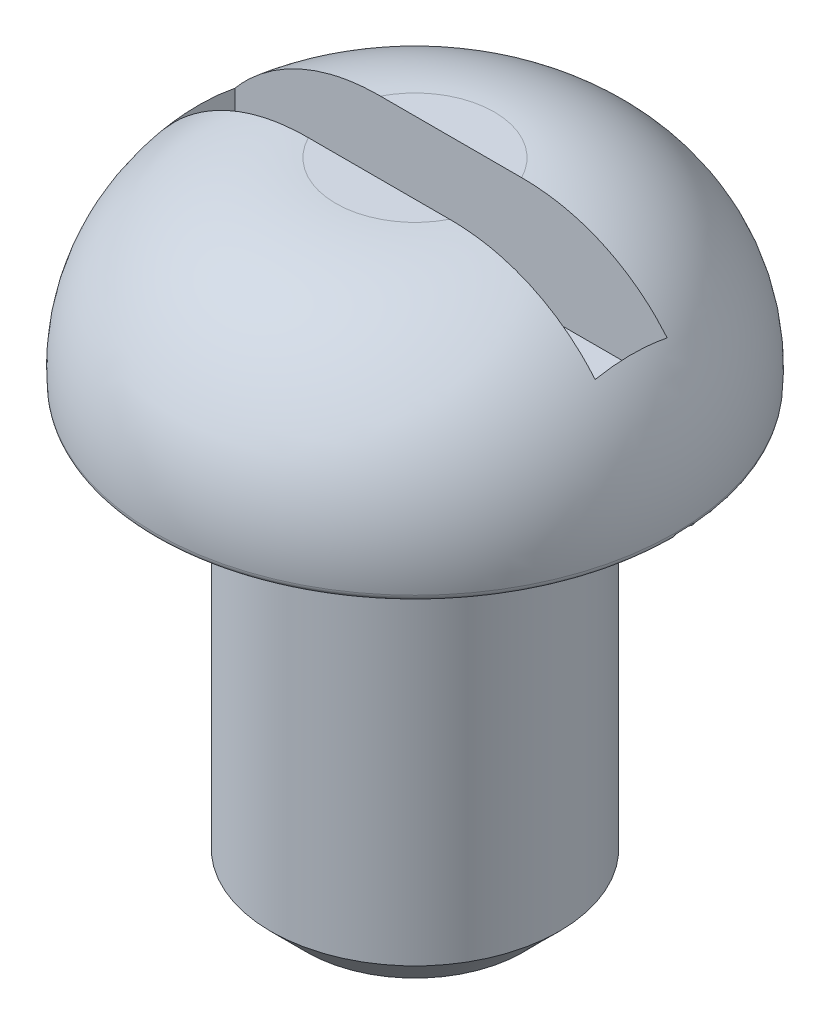
ISO-10303-21;
HEADER;
FILE_DESCRIPTION(('STEP AP214'),'2;1');
FILE_NAME('part.step','',(''),(''),'','','');
FILE_SCHEMA(('AUTOMOTIVE_DESIGN { 1 0 10303 214 1 1 1 1 }'));
ENDSEC;
DATA;
#1=APPLICATION_CONTEXT('core data for automotive mechanical design processes');
#2=APPLICATION_PROTOCOL_DEFINITION('international standard','automotive_design',2000,#1);
#3=PRODUCT_CONTEXT('',#1,'mechanical');
#4=PRODUCT('Part','Part','',(#3));
#5=PRODUCT_RELATED_PRODUCT_CATEGORY('part','',(#4));
#6=PRODUCT_DEFINITION_FORMATION('','',#4);
#7=PRODUCT_DEFINITION_CONTEXT('part definition',#1,'design');
#8=PRODUCT_DEFINITION('design','',#6,#7);
#9=PRODUCT_DEFINITION_SHAPE('','',#8);
#10=(LENGTH_UNIT() NAMED_UNIT(*) SI_UNIT(.MILLI.,.METRE.));
#11=(NAMED_UNIT(*) PLANE_ANGLE_UNIT() SI_UNIT($,.RADIAN.));
#12=(NAMED_UNIT(*) SI_UNIT($,.STERADIAN.) SOLID_ANGLE_UNIT());
#13=UNCERTAINTY_MEASURE_WITH_UNIT(LENGTH_MEASURE(1.E-05),#10,'distance_accuracy_value','');
#14=(GEOMETRIC_REPRESENTATION_CONTEXT(3) GLOBAL_UNCERTAINTY_ASSIGNED_CONTEXT((#13)) GLOBAL_UNIT_ASSIGNED_CONTEXT((#10,
#11,#12)) REPRESENTATION_CONTEXT('',''));
#15=CARTESIAN_POINT('',(0.,0.,0.));
#16=DIRECTION('',(0.,0.,1.));
#17=DIRECTION('',(1.,0.,0.));
#18=AXIS2_PLACEMENT_3D('',#15,#16,#17);
#19=CARTESIAN_POINT('',(0.,8.8,0.));
#20=DIRECTION('',(0.,1.,0.));
#21=DIRECTION('',(0.,0.,1.));
#22=AXIS2_PLACEMENT_3D('',#19,#20,#21);
#23=PLANE('',#22);
#24=DIRECTION('',(-1.,0.,0.));
#25=VECTOR('',#24,1.);
#26=CARTESIAN_POINT('',(-3.,8.8,-0.499999999999999));
#27=LINE('',#26,#25);
#28=CARTESIAN_POINT('',(0.979795897113272,8.8,-0.5));
#29=VERTEX_POINT('',#28);
#30=CARTESIAN_POINT('',(-0.979795897113272,8.8,-0.5));
#31=VERTEX_POINT('',#30);
#32=EDGE_CURVE('E105',#29,#31,#27,.T.);
#33=ORIENTED_EDGE('',*,*,#32,.F.);
#34=CARTESIAN_POINT('',(0.,8.8,0.));
#35=DIRECTION('',(0.,-1.,0.));
#36=DIRECTION('',(0.,0.,-1.));
#37=AXIS2_PLACEMENT_3D('',#34,#35,#36);
#38=CIRCLE('',#37,1.1);
#39=EDGE_CURVE('E128',#31,#29,#38,.T.);
#40=ORIENTED_EDGE('',*,*,#39,.F.);
#41=EDGE_LOOP('',(#33,#40));
#42=FACE_BOUND('',#41,.T.);
#43=ADVANCED_FACE('F29',(#42),#23,.T.);
#44=CARTESIAN_POINT('',(1.5,0.,0.));
#45=DIRECTION('',(0.,-1.,0.));
#46=DIRECTION('',(0.,0.,-1.));
#47=AXIS2_PLACEMENT_3D('',#44,#45,#46);
#48=PLANE('',#47);
#49=CARTESIAN_POINT('',(0.,0.,0.));
#50=DIRECTION('',(0.,-1.,0.));
#51=DIRECTION('',(0.,0.,-1.));
#52=AXIS2_PLACEMENT_3D('',#49,#50,#51);
#53=CIRCLE('',#52,1.5);
#54=CARTESIAN_POINT('',(0.,0.,-1.5));
#55=VERTEX_POINT('',#54);
#56=EDGE_CURVE('E115',#55,#55,#53,.T.);
#57=ORIENTED_EDGE('',*,*,#56,.T.);
#58=EDGE_LOOP('',(#57));
#59=FACE_BOUND('',#58,.T.);
#60=ADVANCED_FACE('F31',(#59),#48,.T.);
#61=DIRECTION('',(1.,0.,0.));
#62=VECTOR('',#61,1.);
#63=CARTESIAN_POINT('',(-3.,8.8,0.5));
#64=LINE('',#63,#62);
#65=CARTESIAN_POINT('',(-0.979795897113272,8.8,0.5));
#66=VERTEX_POINT('',#65);
#67=CARTESIAN_POINT('',(0.979795897113272,8.8,0.5));
#68=VERTEX_POINT('',#67);
#69=EDGE_CURVE('E107',#66,#68,#64,.T.);
#70=ORIENTED_EDGE('',*,*,#69,.F.);
#71=EDGE_CURVE('E131',#68,#66,#38,.T.);
#72=ORIENTED_EDGE('',*,*,#71,.F.);
#73=EDGE_LOOP('',(#70,#72));
#74=FACE_BOUND('',#73,.T.);
#75=ADVANCED_FACE('F176',(#74),#23,.T.);
#76=CARTESIAN_POINT('',(0.,6.28392857142857,0.));
#77=DIRECTION('',(0.,-1.,0.));
#78=DIRECTION('',(0.,0.,-1.));
#79=AXIS2_PLACEMENT_3D('',#76,#77,#78);
#80=DEGENERATE_TOROIDAL_SURFACE('',#79,1.1,2.51607142857143,.T.);
#81=CARTESIAN_POINT('',(0.,8.72741285287453,-0.5));
#82=CARTESIAN_POINT('',(-0.0422818392167979,8.72741654693849,-0.5));
#83=CARTESIAN_POINT('',(-0.0845648077539233,8.72877327592071,-0.5));
#84=CARTESIAN_POINT('',(-0.16903295112575,8.73371678296004,-0.5));
#85=CARTESIAN_POINT('',(-0.211217957322735,8.73730612669833,-0.5));
#86=CARTESIAN_POINT('',(-0.295732319609197,8.74568730123717,-0.5));
#87=CARTESIAN_POINT('',(-0.338060855781322,8.75048672709458,-0.5));
#88=CARTESIAN_POINT('',(-0.42268796162483,8.76026727094819,-0.5));
#89=CARTESIAN_POINT('',(-0.464986535283326,8.7652483565223,-0.5));
#90=CARTESIAN_POINT('',(-0.549995859987487,8.77469082090246,-0.5));
#91=CARTESIAN_POINT('',(-0.592707150305704,8.77914761083377,-0.5));
#92=CARTESIAN_POINT('',(-0.678226998569677,8.78698758227835,-0.5));
#93=CARTESIAN_POINT('',(-0.721035552525858,8.79037080705423,-0.5));
#94=CARTESIAN_POINT('',(-0.84958950567168,8.79837652375647,-0.5));
#95=CARTESIAN_POINT('',(-0.935489790921104,8.80085850297676,-0.5));
#96=CARTESIAN_POINT('',(-1.1067831178282,8.7985979859046,-0.5));
#97=CARTESIAN_POINT('',(-1.19217649378594,8.7938926243803,-0.5));
#98=CARTESIAN_POINT('',(-1.36218346820903,8.7767110644375,-0.5));
#99=CARTESIAN_POINT('',(-1.44679694829237,8.76423370538063,-0.5));
#100=CARTESIAN_POINT('',(-1.67247179942634,8.71978857872035,-0.5));
#101=CARTESIAN_POINT('',(-1.81214349732275,8.68031086977517,-0.5));
#102=CARTESIAN_POINT('',(-2.08327243273732,8.578365307995,-0.5));
#103=CARTESIAN_POINT('',(-2.2147045504002,8.51583080489117,-0.5));
#104=CARTESIAN_POINT('',(-2.46503915559689,8.36922411758531,-0.5));
#105=CARTESIAN_POINT('',(-2.5839377708626,8.28514530456096,-0.499999999999999));
#106=CARTESIAN_POINT('',(-2.80538188060228,8.09787399130032,-0.499999999999999));
#107=CARTESIAN_POINT('',(-2.90794452018514,7.99470177942185,-0.499999999999999));
#108=CARTESIAN_POINT('',(-3.09164169034083,7.77468570273218,-0.499999999999999));
#109=CARTESIAN_POINT('',(-3.17320287222632,7.6581978139942,-0.499999999999999));
#110=CARTESIAN_POINT('',(-3.31544644584769,7.41305955169074,-0.499999999999999));
#111=CARTESIAN_POINT('',(-3.37612390334343,7.28440631293368,-0.499999999999999));
#112=CARTESIAN_POINT('',(-3.47437212103018,7.01976923720552,-0.499999999999999));
#113=CARTESIAN_POINT('',(-3.5121288252665,6.88385439630765,-0.499999999999999));
#114=CARTESIAN_POINT('',(-3.56421697913353,6.60762139502178,-0.499999999999999));
#115=CARTESIAN_POINT('',(-3.57855112578794,6.46730374349831,-0.499999999999999));
#116=CARTESIAN_POINT('',(-3.58337884124122,6.18663409871116,-0.499999999999999));
#117=CARTESIAN_POINT('',(-3.57393572471911,6.04628318963348,-0.499999999999999));
#118=CARTESIAN_POINT('',(-3.5316141639522,5.76915049513041,-0.499999999999999));
#119=CARTESIAN_POINT('',(-3.498734095655,5.63236895772384,-0.499999999999999));
#120=CARTESIAN_POINT('',(-3.41049285796513,5.36628210405101,-0.499999999999999));
#121=CARTESIAN_POINT('',(-3.35513462872845,5.23697581254436,-0.499999999999999));
#122=CARTESIAN_POINT('',(-3.22354867158706,4.98949328322027,-0.499999999999999));
#123=CARTESIAN_POINT('',(-3.14732499631139,4.87131489005098,-0.499999999999999));
#124=CARTESIAN_POINT('',(-2.97603829937548,4.64915027308459,-0.499999999999999));
#125=CARTESIAN_POINT('',(-2.88093963719999,4.54519153648645,-0.499999999999999));
#126=CARTESIAN_POINT('',(-2.67467710760851,4.35454114342512,-0.499999999999999));
#127=CARTESIAN_POINT('',(-2.56350398798273,4.26785950020401,-0.5));
#128=CARTESIAN_POINT('',(-2.32755014511485,4.11360464345636,-0.5));
#129=CARTESIAN_POINT('',(-2.20268187759651,4.04616563243584,-0.5));
#130=CARTESIAN_POINT('',(-1.94368132676,3.93287698782177,-0.5));
#131=CARTESIAN_POINT('',(-1.80956257964428,3.88699654523539,-0.5));
#132=CARTESIAN_POINT('',(-1.60298474041263,3.83440882031757,-0.5));
#133=CARTESIAN_POINT('',(-1.53249789321917,3.81952122194781,-0.5));
#134=CARTESIAN_POINT('',(-1.39052442675912,3.79540495059233,-0.5));
#135=CARTESIAN_POINT('',(-1.3190374804625,3.78617817511717,-0.5));
#136=CARTESIAN_POINT('',(-1.17546901496845,3.77320390137064,-0.5));
#137=CARTESIAN_POINT('',(-1.10338674206885,3.76946497528775,-0.5));
#138=CARTESIAN_POINT('',(-0.959208808371292,3.76709451049405,-0.5));
#139=CARTESIAN_POINT('',(-0.887113210022952,3.76845867124155,-0.5));
#140=CARTESIAN_POINT('',(-0.775214024066887,3.77391123282925,-0.5));
#141=CARTESIAN_POINT('',(-0.735327198974333,3.77651597691304,-0.5));
#142=CARTESIAN_POINT('',(-0.655638244781422,3.78280735406635,-0.5));
#143=CARTESIAN_POINT('',(-0.615836118302233,3.78649402014144,-0.5));
#144=CARTESIAN_POINT('',(-0.536263508131231,3.79462144719697,-0.5));
#145=CARTESIAN_POINT('',(-0.496493120648775,3.79906311317887,-0.5));
#146=CARTESIAN_POINT('',(-0.416975805224194,3.80820548790677,-0.5));
#147=CARTESIAN_POINT('',(-0.377228883093883,3.81290624516751,-0.5));
#148=CARTESIAN_POINT('',(-0.297586444851774,3.82187883252253,-0.5));
#149=CARTESIAN_POINT('',(-0.25769080182081,3.82614959807181,-0.5));
#150=CARTESIAN_POINT('',(-0.177783910072658,3.83335474877311,-0.5));
#151=CARTESIAN_POINT('',(-0.137772712092002,3.83628965066493,-0.5));
#152=CARTESIAN_POINT('',(-0.0577077415049967,3.83999017238345,-0.5));
#153=CARTESIAN_POINT('',(-0.0176541585425309,3.84075949122909,-0.5));
#154=CARTESIAN_POINT('',(0.0624280292990351,3.83988319172582,-0.5));
#155=CARTESIAN_POINT('',(0.102456631415338,3.83823734184884,-0.5));
#156=CARTESIAN_POINT('',(0.200234845544321,3.83189818281024,-0.5));
#157=CARTESIAN_POINT('',(0.257909097546066,3.826171639196,-0.5));
#158=CARTESIAN_POINT('',(0.373130582436597,3.81349379269112,-0.5));
#159=CARTESIAN_POINT('',(0.430677721845475,3.80654177881028,-0.5));
#160=CARTESIAN_POINT('',(0.546015792537371,3.79352048271878,-0.5));
#161=CARTESIAN_POINT('',(0.603806980698211,3.78745323987419,-0.5));
#162=CARTESIAN_POINT('',(0.719564756314967,3.77745828343069,-0.5));
#163=CARTESIAN_POINT('',(0.777531278219116,3.77352985070593,-0.5));
#164=CARTESIAN_POINT('',(0.893172400195653,3.76854275544782,-0.5));
#165=CARTESIAN_POINT('',(0.950846012476756,3.76746320269116,-0.5));
#166=CARTESIAN_POINT('',(1.06616353736375,3.76851252292201,-0.5));
#167=CARTESIAN_POINT('',(1.12380744653326,3.77064170814559,-0.5));
#168=CARTESIAN_POINT('',(1.29646264418287,3.78223867600054,-0.5));
#169=CARTESIAN_POINT('',(1.41119794735551,3.79691584185622,-0.5));
#170=CARTESIAN_POINT('',(1.59489926285845,3.83261559149393,-0.5));
#171=CARTESIAN_POINT('',(1.66477164806265,3.84914222822954,-0.5));
#172=CARTESIAN_POINT('',(1.80287380943863,3.88784500339178,-0.5));
#173=CARTESIAN_POINT('',(1.8711047501223,3.91001699914347,-0.5));
#174=CARTESIAN_POINT('',(2.07410752672873,3.98549592029451,-0.5));
#175=CARTESIAN_POINT('',(2.20577330597763,4.04749461160393,-0.5));
#176=CARTESIAN_POINT('',(2.45633142382588,4.19288225773033,-0.5));
#177=CARTESIAN_POINT('',(2.57524579148441,4.27623345148029,-0.5));
#178=CARTESIAN_POINT('',(2.79655315203982,4.46171351618864,-0.5));
#179=CARTESIAN_POINT('',(2.89901563927389,4.56375928253144,-0.5));
#180=CARTESIAN_POINT('',(3.08333361106216,4.78206180281882,-0.5));
#181=CARTESIAN_POINT('',(3.16550705350707,4.89805031237571,-0.5));
#182=CARTESIAN_POINT('',(3.30914359276284,5.14243512151083,-0.5));
#183=CARTESIAN_POINT('',(3.37057811060937,5.27084823183649,-0.5));
#184=CARTESIAN_POINT('',(3.47032106842233,5.53507437796322,-0.5));
#185=CARTESIAN_POINT('',(3.50882693864908,5.67081292873242,-0.5));
#186=CARTESIAN_POINT('',(3.562418994764,5.94677909958349,-0.5));
#187=CARTESIAN_POINT('',(3.5775152322762,6.08700476657572,-0.5));
#188=CARTESIAN_POINT('',(3.58387202437275,6.36763441034357,-0.5));
#189=CARTESIAN_POINT('',(3.57519350318312,6.50803701151939,-0.5));
#190=CARTESIAN_POINT('',(3.53438074581867,6.7854018053742,-0.5));
#191=CARTESIAN_POINT('',(3.50224468403048,6.92236372941982,-0.5));
#192=CARTESIAN_POINT('',(3.41545623121342,7.18891178477867,-0.5));
#193=CARTESIAN_POINT('',(3.36081037331555,7.31850004377764,-0.5));
#194=CARTESIAN_POINT('',(3.23057736221933,7.56669297613496,-0.5));
#195=CARTESIAN_POINT('',(3.15498920043748,7.68529712013004,-0.5));
#196=CARTESIAN_POINT('',(2.98487308180984,7.90843444683799,-0.5));
#197=CARTESIAN_POINT('',(2.89030540717658,8.01293734029921,-0.5));
#198=CARTESIAN_POINT('',(2.68507678186927,8.20467666265842,-0.5));
#199=CARTESIAN_POINT('',(2.5744185663433,8.29191602015743,-0.5));
#200=CARTESIAN_POINT('',(2.33946571548053,8.44732744855812,-0.5));
#201=CARTESIAN_POINT('',(2.21509014848477,8.51537689733444,-0.5));
#202=CARTESIAN_POINT('',(1.95675563445144,8.63006319207496,-0.5));
#203=CARTESIAN_POINT('',(1.8227946326022,8.67669543088194,-0.5));
#204=CARTESIAN_POINT('',(1.61639044375143,8.73038764423974,-0.5));
#205=CARTESIAN_POINT('',(1.54596802681154,8.74564158709015,-0.5));
#206=CARTESIAN_POINT('',(1.40410609749614,8.77048002201431,-0.5));
#207=CARTESIAN_POINT('',(1.33266644460989,8.78006372292354,-0.5));
#208=CARTESIAN_POINT('',(1.18926106846354,8.79372391525551,-0.5));
#209=CARTESIAN_POINT('',(1.11729524330599,8.79779930993727,-0.5));
#210=CARTESIAN_POINT('',(0.973303073568273,8.8008297297292,-0.5));
#211=CARTESIAN_POINT('',(0.901276777340399,8.79978731790852,-0.5));
#212=CARTESIAN_POINT('',(0.759833351892091,8.79343428096995,-0.5));
#213=CARTESIAN_POINT('',(0.690409077868166,8.78826668745101,-0.5));
#214=CARTESIAN_POINT('',(0.5864412631836,8.77846298930097,-0.5));
#215=CARTESIAN_POINT('',(0.551792076389236,8.77485017189743,-0.5));
#216=CARTESIAN_POINT('',(0.482536872530976,8.76722779086835,-0.5));
#217=CARTESIAN_POINT('',(0.447930856213372,8.76321822047776,-0.5));
#218=CARTESIAN_POINT('',(0.378954746753076,8.7552063552449,-0.5));
#219=CARTESIAN_POINT('',(0.344584635203563,8.75120419343899,-0.5));
#220=CARTESIAN_POINT('',(0.275788988001554,8.7436731451844,-0.5));
#221=CARTESIAN_POINT('',(0.241363450768218,8.74014427248575,-0.5));
#222=CARTESIAN_POINT('',(0.172485362325036,8.7341476882484,-0.5));
#223=CARTESIAN_POINT('',(0.138033012391918,8.73167780854752,-0.5));
#224=CARTESIAN_POINT('',(0.0690540126144135,8.72830907324241,-0.5));
#225=CARTESIAN_POINT('',(0.0345273828434017,8.72740983629902,-0.5));
#226=CARTESIAN_POINT('',(0.,8.72741285287453,-0.5));
#227=B_SPLINE_CURVE_WITH_KNOTS('',3,(#81,#82,#83,#84,#85,#86,#87,#88,#89,#90,#91,#92,#93,#94,
#95,#96,#97,#98,#99,#100,#101,#102,#103,#104,#105,#106,#107,#108,#109,#110,#111,#112,#113,#114,
#115,#116,#117,#118,#119,#120,#121,#122,#123,#124,#125,#126,#127,#128,#129,#130,#131,#132,#133,
#134,#135,#136,#137,#138,#139,#140,#141,#142,#143,#144,#145,#146,#147,#148,#149,#150,#151,#152,
#153,#154,#155,#156,#157,#158,#159,#160,#161,#162,#163,#164,#165,#166,#167,#168,#169,#170,#171,
#172,#173,#174,#175,#176,#177,#178,#179,#180,#181,#182,#183,#184,#185,#186,#187,#188,#189,#190,
#191,#192,#193,#194,#195,#196,#197,#198,#199,#200,#201,#202,#203,#204,#205,#206,#207,#208,#209,
#210,#211,#212,#213,#214,#215,#216,#217,#218,#219,#220,#221,#222,#223,#224,#225,#226),
.UNSPECIFIED.,.T.,.F.,(4,2,2,2,2,2,2,2,2,2,2,2,2,2,2,2,2,2,2,2,2,2,2,2,2,2,2,2,2,2,2,2,2,2,2,2,
2,2,2,2,2,2,2,2,2,2,2,2,2,2,2,2,2,2,2,2,2,2,2,2,2,2,2,2,2,2,2,2,2,2,2,2,4),(0.,
0.126832445010955,0.253810913582559,0.38160711285812,0.509380614001817,0.638200232580602,
0.767014659317311,1.02456319614758,1.28078555308018,1.53704618238923,1.97035679177588,
2.40492991997873,2.83963691992653,3.27388463166759,3.69845356976823,4.12312275288421,
4.54429910250408,4.96542695175598,5.38543459801147,5.80547135132612,6.22545318128816,
6.64535349732551,7.06605436134676,7.48699834543457,7.91081008137102,8.33401429898668,
8.54994817728238,8.76595439722896,8.9822976677333,9.19845865962705,9.31836039848569,
9.43826579549813,9.55831594725931,9.67838865524539,9.79875167646173,9.91906809911172,
10.0391788849595,10.1593011858772,10.3331086877597,10.507017362734,10.6813207613517,
10.8555655181996,11.0285289789845,11.2015092715958,11.5474682304916,11.7626498055027,
11.9776739288769,12.4119939426601,12.8455511178588,13.2772257761513,13.7016312130657,
14.1266191306346,14.547892631159,14.968985195205,15.3889996947157,15.8090468858825,
16.2289722504485,16.6489178421799,17.0697515792289,17.4905138643667,17.9139068279665,
18.3373908270173,18.5533648573046,18.7693690151815,18.9854161746131,19.2013551456427,
19.4101160847006,19.5146257294316,19.6191371564655,19.7229443364761,19.8267545316491,
19.9303511609617,20.0339226343643),.UNSPECIFIED.);
#228=CARTESIAN_POINT('',(3.,7.88444543075919,-0.5));
#229=VERTEX_POINT('',#228);
#230=EDGE_CURVE('E11',#229,#29,#227,.T.);
#231=ORIENTED_EDGE('',*,*,#230,.F.);
#232=CARTESIAN_POINT('',(3.,7.93335739186111,0.));
#233=CARTESIAN_POINT('',(3.,7.93336461310188,-0.154184867381827));
#234=CARTESIAN_POINT('',(3.,7.9197293123384,-0.308634480967941));
#235=CARTESIAN_POINT('',(3.,7.8641803133891,-0.612738389217278));
#236=CARTESIAN_POINT('',(3.,7.82222092261654,-0.762384525623875));
#237=CARTESIAN_POINT('',(3.,7.72526504634106,-1.00661273643669));
#238=CARTESIAN_POINT('',(3.,7.67795204285815,-1.10424950305777));
#239=CARTESIAN_POINT('',(3.,7.56812874673176,-1.29045349555034));
#240=CARTESIAN_POINT('',(3.,7.50565260783125,-1.37904047693242));
#241=CARTESIAN_POINT('',(3.,7.37642763604719,-1.53098505261685));
#242=CARTESIAN_POINT('',(3.,7.31178499758491,-1.59612980062483));
#243=CARTESIAN_POINT('',(3.,7.17252784832791,-1.71483755019827));
#244=CARTESIAN_POINT('',(3.,7.09791362605457,-1.7684008867471));
#245=CARTESIAN_POINT('',(3.,6.9398692815416,-1.86168486276998));
#246=CARTESIAN_POINT('',(3.,6.85639334468504,-1.90132849707851));
#247=CARTESIAN_POINT('',(3.,6.68345548001443,-1.96417971442271));
#248=CARTESIAN_POINT('',(3.,6.59399675278274,-1.98739600973284));
#249=CARTESIAN_POINT('',(3.,6.42161625631112,-2.01456662623953));
#250=CARTESIAN_POINT('',(3.,6.33896414326272,-2.02025116068091));
#251=CARTESIAN_POINT('',(3.,6.17396136136139,-2.01701940234604));
#252=CARTESIAN_POINT('',(3.,6.09161060386738,-2.0081078190201));
#253=CARTESIAN_POINT('',(3.,5.93300956772154,-1.97678912412979));
#254=CARTESIAN_POINT('',(3.,5.85664726495929,-1.95494243069133));
#255=CARTESIAN_POINT('',(3.,5.70847862984289,-1.89919651953525));
#256=CARTESIAN_POINT('',(3.,5.63667257392384,-1.86529657134894));
#257=CARTESIAN_POINT('',(3.,5.49655995404805,-1.78530449862206));
#258=CARTESIAN_POINT('',(3.,5.42849253275641,-1.73879537527413));
#259=CARTESIAN_POINT('',(3.,5.30018735152327,-1.63603856746414));
#260=CARTESIAN_POINT('',(3.,5.23995223263282,-1.5797876128911));
#261=CARTESIAN_POINT('',(3.,5.1220309802308,-1.45293717811815));
#262=CARTESIAN_POINT('',(3.,5.06530665862844,-1.3814465069673));
#263=CARTESIAN_POINT('',(3.,4.96265526497357,-1.23112499349274));
#264=CARTESIAN_POINT('',(3.,4.91673383716525,-1.15229034401645));
#265=CARTESIAN_POINT('',(3.,4.82875737127662,-0.975617614991071));
#266=CARTESIAN_POINT('',(3.,4.7886493227128,-0.876812512176411));
#267=CARTESIAN_POINT('',(3.,4.72245308968346,-0.674638460242953));
#268=CARTESIAN_POINT('',(3.,4.69637374778571,-0.571266676967368));
#269=CARTESIAN_POINT('',(3.,4.6536975094114,-0.340828407679236));
#270=CARTESIAN_POINT('',(3.,4.64009224889631,-0.213204469845906));
#271=CARTESIAN_POINT('',(3.,4.63169621338285,0.042798410844744));
#272=CARTESIAN_POINT('',(3.,4.63693331736424,0.171178191636854));
#273=CARTESIAN_POINT('',(3.,4.66847011687393,0.442720920924669));
#274=CARTESIAN_POINT('',(3.,4.69747296739361,0.585584555395529));
#275=CARTESIAN_POINT('',(3.,4.78140978260964,0.863438437540756));
#276=CARTESIAN_POINT('',(3.,4.83628764493806,0.998445012889439));
#277=CARTESIAN_POINT('',(3.,4.95245676424918,1.21509293732962));
#278=CARTESIAN_POINT('',(3.,5.00675082641463,1.3004978897973));
#279=CARTESIAN_POINT('',(3.,5.12857283936112,1.46135850667192));
#280=CARTESIAN_POINT('',(3.,5.19609339333045,1.5368196927775));
#281=CARTESIAN_POINT('',(3.,5.34420546062528,1.67504434566068));
#282=CARTESIAN_POINT('',(3.,5.42489660236604,1.73770211736695));
#283=CARTESIAN_POINT('',(3.,5.59701464073841,1.84603763329798));
#284=CARTESIAN_POINT('',(3.,5.68843313843661,1.89172854644452));
#285=CARTESIAN_POINT('',(3.,5.86596926658714,1.95838497974242));
#286=CARTESIAN_POINT('',(3.,5.95115367974155,1.98184459035223));
#287=CARTESIAN_POINT('',(3.,6.12438427971692,2.01256302199119));
#288=CARTESIAN_POINT('',(3.,6.21242861197037,2.01983213735679));
#289=CARTESIAN_POINT('',(3.,6.38043615698326,2.01787478754687));
#290=CARTESIAN_POINT('',(3.,6.46041959931175,2.01006202839145));
#291=CARTESIAN_POINT('',(3.,6.6179061731293,1.9810650617856));
#292=CARTESIAN_POINT('',(3.,6.69540966463317,1.9598828045252));
#293=CARTESIAN_POINT('',(3.,6.84567445351991,1.90517607155327));
#294=CARTESIAN_POINT('',(3.,6.91844739026499,1.87168335157832));
#295=CARTESIAN_POINT('',(3.,7.05784039456533,1.79373433512546));
#296=CARTESIAN_POINT('',(3.,7.1244590265385,1.74927548946905));
#297=CARTESIAN_POINT('',(3.,7.25487134734267,1.64750728180445));
#298=CARTESIAN_POINT('',(3.,7.31812404124668,1.58950721373673));
#299=CARTESIAN_POINT('',(3.,7.43539516716216,1.46486839496237));
#300=CARTESIAN_POINT('',(3.,7.48941078608306,1.39822702342906));
#301=CARTESIAN_POINT('',(3.,7.59462527161511,1.24870293407758));
#302=CARTESIAN_POINT('',(3.,7.64443363165447,1.16484490536442));
#303=CARTESIAN_POINT('',(3.,7.73186070837906,0.990966421645666));
#304=CARTESIAN_POINT('',(3.,7.76946552499681,0.900939079994877));
#305=CARTESIAN_POINT('',(3.,7.83894291603379,0.699207880366169));
#306=CARTESIAN_POINT('',(3.,7.86833787364544,0.586655008454969));
#307=CARTESIAN_POINT('',(3.,7.91112455360347,0.358730572586322));
#308=CARTESIAN_POINT('',(3.,7.92453952921339,0.243363354188531));
#309=CARTESIAN_POINT('',(3.,7.93231181967244,0.0851859596883014));
#310=CARTESIAN_POINT('',(3.,7.93335539654763,0.0426030862879897));
#311=CARTESIAN_POINT('',(3.,7.93335739186111,0.));
#312=B_SPLINE_CURVE_WITH_KNOTS('',3,(#232,#233,#234,#235,#236,#237,#238,#239,#240,#241,#242,
#243,#244,#245,#246,#247,#248,#249,#250,#251,#252,#253,#254,#255,#256,#257,#258,#259,#260,#261,
#262,#263,#264,#265,#266,#267,#268,#269,#270,#271,#272,#273,#274,#275,#276,#277,#278,#279,#280,
#281,#282,#283,#284,#285,#286,#287,#288,#289,#290,#291,#292,#293,#294,#295,#296,#297,#298,#299,
#300,#301,#302,#303,#304,#305,#306,#307,#308,#309,#310,#311),.UNSPECIFIED.,.T.,.F.,(4,2,2,2,2,2,
2,2,2,2,2,2,2,2,2,2,2,2,2,2,2,2,2,2,2,2,2,2,2,2,2,2,2,2,2,2,2,2,2,4),(0.,0.462418793853954,
0.925585352802772,1.24985033038329,1.57339159717828,1.84756997016048,2.12174041168414,
2.39740454050721,2.67292236046499,2.92020383836321,3.16740554639014,3.40460893901155,
3.6418267094253,3.88812413472772,4.13450439728723,4.40723838781147,4.68011456016615,
4.9988530127053,5.31779213759775,5.70134864783786,6.08547289779954,6.52057767545824,
6.95474336411365,7.2571856094031,7.55945919664367,7.86413539925472,8.1685746289986,
8.43218694030348,8.6956315921638,8.93557458959559,9.17548259496344,9.41477603433159,
9.65412515220916,9.9105574888536,10.1670677817415,10.4585857025945,10.7504345118766,
11.0981845309878,11.4454279012428,11.5731996346838),.UNSPECIFIED.);
#313=CARTESIAN_POINT('',(3.,7.88444543075925,0.5));
#314=VERTEX_POINT('',#313);
#315=EDGE_CURVE('E33',#314,#229,#312,.T.);
#316=ORIENTED_EDGE('',*,*,#315,.F.);
#317=CARTESIAN_POINT('',(0.,8.72741285287453,0.5));
#318=CARTESIAN_POINT('',(0.0422818392167981,8.72741654693849,0.5));
#319=CARTESIAN_POINT('',(0.0845648077539235,8.72877327592071,0.5));
#320=CARTESIAN_POINT('',(0.16903295112575,8.73371678296004,0.5));
#321=CARTESIAN_POINT('',(0.211217957322736,8.73730612669833,0.5));
#322=CARTESIAN_POINT('',(0.295732319609198,8.74568730123717,0.5));
#323=CARTESIAN_POINT('',(0.338060855781322,8.75048672709458,0.5));
#324=CARTESIAN_POINT('',(0.422687961624831,8.76026727094819,0.5));
#325=CARTESIAN_POINT('',(0.464986535283327,8.7652483565223,0.5));
#326=CARTESIAN_POINT('',(0.549995859987488,8.77469082090246,0.5));
#327=CARTESIAN_POINT('',(0.592707150305705,8.77914761083377,0.5));
#328=CARTESIAN_POINT('',(0.678226998569677,8.78698758227835,0.5));
#329=CARTESIAN_POINT('',(0.721035552525859,8.79037080705423,0.5));
#330=CARTESIAN_POINT('',(0.849589505671681,8.79837652375647,0.5));
#331=CARTESIAN_POINT('',(0.935489790921105,8.80085850297676,0.5));
#332=CARTESIAN_POINT('',(1.1067831178282,8.7985979859046,0.5));
#333=CARTESIAN_POINT('',(1.19217649378594,8.7938926243803,0.5));
#334=CARTESIAN_POINT('',(1.36218346820903,8.7767110644375,0.5));
#335=CARTESIAN_POINT('',(1.44679694829237,8.76423370538063,0.5));
#336=CARTESIAN_POINT('',(1.67247179942634,8.71978857872035,0.5));
#337=CARTESIAN_POINT('',(1.81214349732276,8.68031086977517,0.5));
#338=CARTESIAN_POINT('',(2.08327243273732,8.578365307995,0.5));
#339=CARTESIAN_POINT('',(2.2147045504002,8.51583080489117,0.5));
#340=CARTESIAN_POINT('',(2.46503915559689,8.36922411758531,0.5));
#341=CARTESIAN_POINT('',(2.5839377708626,8.28514530456096,0.5));
#342=CARTESIAN_POINT('',(2.80538188060228,8.09787399130032,0.5));
#343=CARTESIAN_POINT('',(2.90794452018514,7.99470177942185,0.5));
#344=CARTESIAN_POINT('',(3.09164169034083,7.77468570273218,0.5));
#345=CARTESIAN_POINT('',(3.17320287222632,7.6581978139942,0.5));
#346=CARTESIAN_POINT('',(3.31544644584769,7.41305955169074,0.5));
#347=CARTESIAN_POINT('',(3.37612390334343,7.28440631293368,0.5));
#348=CARTESIAN_POINT('',(3.47437212103018,7.01976923720551,0.5));
#349=CARTESIAN_POINT('',(3.5121288252665,6.88385439630765,0.5));
#350=CARTESIAN_POINT('',(3.56421697913353,6.60762139502178,0.5));
#351=CARTESIAN_POINT('',(3.57855112578794,6.46730374349831,0.5));
#352=CARTESIAN_POINT('',(3.58337884124122,6.18663409871115,0.5));
#353=CARTESIAN_POINT('',(3.57393572471911,6.04628318963348,0.5));
#354=CARTESIAN_POINT('',(3.5316141639522,5.76915049513041,0.5));
#355=CARTESIAN_POINT('',(3.498734095655,5.63236895772384,0.5));
#356=CARTESIAN_POINT('',(3.41049285796513,5.36628210405101,0.5));
#357=CARTESIAN_POINT('',(3.35513462872845,5.23697581254436,0.5));
#358=CARTESIAN_POINT('',(3.22354867158706,4.98949328322026,0.5));
#359=CARTESIAN_POINT('',(3.14732499631139,4.87131489005098,0.5));
#360=CARTESIAN_POINT('',(2.97603829937548,4.64915027308459,0.5));
#361=CARTESIAN_POINT('',(2.88093963719998,4.54519153648645,0.5));
#362=CARTESIAN_POINT('',(2.67467710760851,4.35454114342512,0.5));
#363=CARTESIAN_POINT('',(2.56350398798273,4.26785950020401,0.5));
#364=CARTESIAN_POINT('',(2.32755014511485,4.11360464345636,0.5));
#365=CARTESIAN_POINT('',(2.20268187759651,4.04616563243584,0.5));
#366=CARTESIAN_POINT('',(1.94368132676,3.93287698782177,0.5));
#367=CARTESIAN_POINT('',(1.80956257964428,3.88699654523539,0.5));
#368=CARTESIAN_POINT('',(1.60298474041262,3.83440882031757,0.5));
#369=CARTESIAN_POINT('',(1.53249789321916,3.81952122194781,0.5));
#370=CARTESIAN_POINT('',(1.39052442675912,3.79540495059233,0.5));
#371=CARTESIAN_POINT('',(1.3190374804625,3.78617817511717,0.5));
#372=CARTESIAN_POINT('',(1.17546901496844,3.77320390137064,0.5));
#373=CARTESIAN_POINT('',(1.10338674206884,3.76946497528774,0.5));
#374=CARTESIAN_POINT('',(0.959208808371289,3.76709451049405,0.5));
#375=CARTESIAN_POINT('',(0.887113210022949,3.76845867124155,0.5));
#376=CARTESIAN_POINT('',(0.775214024066884,3.77391123282925,0.5));
#377=CARTESIAN_POINT('',(0.73532719897433,3.77651597691304,0.5));
#378=CARTESIAN_POINT('',(0.655638244781419,3.78280735406635,0.5));
#379=CARTESIAN_POINT('',(0.615836118302231,3.78649402014144,0.5));
#380=CARTESIAN_POINT('',(0.53626350813123,3.79462144719697,0.5));
#381=CARTESIAN_POINT('',(0.496493120648774,3.79906311317887,0.5));
#382=CARTESIAN_POINT('',(0.416975805224192,3.80820548790677,0.5));
#383=CARTESIAN_POINT('',(0.377228883093881,3.81290624516751,0.5));
#384=CARTESIAN_POINT('',(0.297586444851771,3.82187883252253,0.5));
#385=CARTESIAN_POINT('',(0.257690801820808,3.82614959807181,0.5));
#386=CARTESIAN_POINT('',(0.177783910072655,3.83335474877311,0.5));
#387=CARTESIAN_POINT('',(0.137772712091998,3.83628965066493,0.5));
#388=CARTESIAN_POINT('',(0.0577077415049931,3.83999017238345,0.5));
#389=CARTESIAN_POINT('',(0.0176541585425278,3.84075949122909,0.5));
#390=CARTESIAN_POINT('',(-0.0624280292990381,3.83988319172582,0.5));
#391=CARTESIAN_POINT('',(-0.102456631415342,3.83823734184884,0.5));
#392=CARTESIAN_POINT('',(-0.200234845544324,3.83189818281024,0.5));
#393=CARTESIAN_POINT('',(-0.257909097546069,3.826171639196,0.5));
#394=CARTESIAN_POINT('',(-0.3731305824366,3.81349379269112,0.5));
#395=CARTESIAN_POINT('',(-0.430677721845478,3.80654177881028,0.5));
#396=CARTESIAN_POINT('',(-0.546015792537373,3.79352048271878,0.5));
#397=CARTESIAN_POINT('',(-0.603806980698212,3.78745323987419,0.5));
#398=CARTESIAN_POINT('',(-0.719564756314968,3.77745828343069,0.5));
#399=CARTESIAN_POINT('',(-0.777531278219116,3.77352985070593,0.5));
#400=CARTESIAN_POINT('',(-0.893172400195651,3.76854275544782,0.5));
#401=CARTESIAN_POINT('',(-0.950846012476752,3.76746320269116,0.5));
#402=CARTESIAN_POINT('',(-1.06616353736375,3.76851252292201,0.5));
#403=CARTESIAN_POINT('',(-1.12380744653326,3.77064170814559,0.5));
#404=CARTESIAN_POINT('',(-1.29646264418287,3.78223867600053,0.5));
#405=CARTESIAN_POINT('',(-1.4111979473555,3.79691584185622,0.5));
#406=CARTESIAN_POINT('',(-1.59489926285844,3.83261559149393,0.5));
#407=CARTESIAN_POINT('',(-1.66477164806264,3.84914222822954,0.5));
#408=CARTESIAN_POINT('',(-1.80287380943863,3.88784500339178,0.5));
#409=CARTESIAN_POINT('',(-1.87110475012229,3.91001699914347,0.5));
#410=CARTESIAN_POINT('',(-2.07410752672873,3.98549592029451,0.5));
#411=CARTESIAN_POINT('',(-2.20577330597762,4.04749461160393,0.5));
#412=CARTESIAN_POINT('',(-2.45633142382587,4.19288225773032,0.5));
#413=CARTESIAN_POINT('',(-2.5752457914844,4.27623345148029,0.5));
#414=CARTESIAN_POINT('',(-2.79655315203982,4.46171351618864,0.5));
#415=CARTESIAN_POINT('',(-2.89901563927389,4.56375928253144,0.5));
#416=CARTESIAN_POINT('',(-3.08333361106216,4.78206180281882,0.5));
#417=CARTESIAN_POINT('',(-3.16550705350707,4.89805031237571,0.5));
#418=CARTESIAN_POINT('',(-3.30914359276283,5.14243512151083,0.5));
#419=CARTESIAN_POINT('',(-3.37057811060937,5.27084823183649,0.5));
#420=CARTESIAN_POINT('',(-3.47032106842233,5.53507437796322,0.5));
#421=CARTESIAN_POINT('',(-3.50882693864908,5.67081292873242,0.500000000000001));
#422=CARTESIAN_POINT('',(-3.562418994764,5.94677909958348,0.500000000000001));
#423=CARTESIAN_POINT('',(-3.5775152322762,6.08700476657571,0.500000000000001));
#424=CARTESIAN_POINT('',(-3.58387202437275,6.36763441034357,0.500000000000001));
#425=CARTESIAN_POINT('',(-3.57519350318312,6.50803701151939,0.500000000000001));
#426=CARTESIAN_POINT('',(-3.53438074581867,6.7854018053742,0.500000000000001));
#427=CARTESIAN_POINT('',(-3.50224468403048,6.92236372941981,0.5));
#428=CARTESIAN_POINT('',(-3.41545623121342,7.18891178477867,0.5));
#429=CARTESIAN_POINT('',(-3.36081037331555,7.31850004377764,0.5));
#430=CARTESIAN_POINT('',(-3.23057736221934,7.56669297613496,0.5));
#431=CARTESIAN_POINT('',(-3.15498920043748,7.68529712013004,0.5));
#432=CARTESIAN_POINT('',(-2.98487308180984,7.90843444683799,0.5));
#433=CARTESIAN_POINT('',(-2.89030540717658,8.0129373402992,0.5));
#434=CARTESIAN_POINT('',(-2.68507678186927,8.20467666265841,0.5));
#435=CARTESIAN_POINT('',(-2.5744185663433,8.29191602015743,0.5));
#436=CARTESIAN_POINT('',(-2.33946571548053,8.44732744855812,0.5));
#437=CARTESIAN_POINT('',(-2.21509014848477,8.51537689733444,0.5));
#438=CARTESIAN_POINT('',(-1.95675563445145,8.63006319207495,0.5));
#439=CARTESIAN_POINT('',(-1.8227946326022,8.67669543088194,0.5));
#440=CARTESIAN_POINT('',(-1.61639044375143,8.73038764423974,0.5));
#441=CARTESIAN_POINT('',(-1.54596802681154,8.74564158709015,0.5));
#442=CARTESIAN_POINT('',(-1.40410609749614,8.77048002201431,0.5));
#443=CARTESIAN_POINT('',(-1.33266644460989,8.78006372292354,0.5));
#444=CARTESIAN_POINT('',(-1.18926106846355,8.79372391525551,0.5));
#445=CARTESIAN_POINT('',(-1.11729524330599,8.79779930993727,0.5));
#446=CARTESIAN_POINT('',(-0.973303073568279,8.8008297297292,0.5));
#447=CARTESIAN_POINT('',(-0.901276777340404,8.79978731790852,0.5));
#448=CARTESIAN_POINT('',(-0.759833351892094,8.79343428096995,0.5));
#449=CARTESIAN_POINT('',(-0.690409077868167,8.78826668745101,0.5));
#450=CARTESIAN_POINT('',(-0.586441263183601,8.77846298930097,0.5));
#451=CARTESIAN_POINT('',(-0.551792076389238,8.77485017189743,0.5));
#452=CARTESIAN_POINT('',(-0.482536872530978,8.76722779086835,0.5));
#453=CARTESIAN_POINT('',(-0.447930856213373,8.76321822047776,0.5));
#454=CARTESIAN_POINT('',(-0.378954746753076,8.7552063552449,0.5));
#455=CARTESIAN_POINT('',(-0.344584635203562,8.75120419343899,0.5));
#456=CARTESIAN_POINT('',(-0.275788988001554,8.7436731451844,0.5));
#457=CARTESIAN_POINT('',(-0.241363450768218,8.74014427248575,0.5));
#458=CARTESIAN_POINT('',(-0.172485362325036,8.7341476882484,0.5));
#459=CARTESIAN_POINT('',(-0.138033012391918,8.73167780854752,0.5));
#460=CARTESIAN_POINT('',(-0.0690540126144134,8.72830907324241,0.5));
#461=CARTESIAN_POINT('',(-0.0345273828434016,8.72740983629902,0.5));
#462=CARTESIAN_POINT('',(0.,8.72741285287453,0.5));
#463=B_SPLINE_CURVE_WITH_KNOTS('',3,(#317,#318,#319,#320,#321,#322,#323,#324,#325,#326,#327,
#328,#329,#330,#331,#332,#333,#334,#335,#336,#337,#338,#339,#340,#341,#342,#343,#344,#345,#346,
#347,#348,#349,#350,#351,#352,#353,#354,#355,#356,#357,#358,#359,#360,#361,#362,#363,#364,#365,
#366,#367,#368,#369,#370,#371,#372,#373,#374,#375,#376,#377,#378,#379,#380,#381,#382,#383,#384,
#385,#386,#387,#388,#389,#390,#391,#392,#393,#394,#395,#396,#397,#398,#399,#400,#401,#402,#403,
#404,#405,#406,#407,#408,#409,#410,#411,#412,#413,#414,#415,#416,#417,#418,#419,#420,#421,#422,
#423,#424,#425,#426,#427,#428,#429,#430,#431,#432,#433,#434,#435,#436,#437,#438,#439,#440,#441,
#442,#443,#444,#445,#446,#447,#448,#449,#450,#451,#452,#453,#454,#455,#456,#457,#458,#459,#460,
#461,#462),.UNSPECIFIED.,.T.,.F.,(4,2,2,2,2,2,2,2,2,2,2,2,2,2,2,2,2,2,2,2,2,2,2,2,2,2,2,2,2,2,2,
2,2,2,2,2,2,2,2,2,2,2,2,2,2,2,2,2,2,2,2,2,2,2,2,2,2,2,2,2,2,2,2,2,2,2,2,2,2,2,2,2,4),(0.,
0.126832445010955,0.253810913582559,0.381607112858121,0.509380614001818,0.638200232580602,
0.767014659317312,1.02456319614758,1.28078555308018,1.53704618238923,1.97035679177588,
2.40492991997873,2.83963691992653,3.27388463166759,3.69845356976823,4.12312275288421,
4.54429910250409,4.96542695175598,5.38543459801148,5.80547135132612,6.22545318128816,
6.64535349732551,7.06605436134676,7.48699834543457,7.91081008137102,8.33401429898668,
8.54994817728239,8.76595439722897,8.9822976677333,9.19845865962705,9.31836039848569,
9.43826579549813,9.55831594725931,9.67838865524539,9.79875167646173,9.91906809911173,
10.0391788849595,10.1593011858772,10.3331086877597,10.507017362734,10.6813207613517,
10.8555655181996,11.0285289789845,11.2015092715957,11.5474682304916,11.7626498055027,
11.9776739288769,12.4119939426601,12.8455511178588,13.2772257761513,13.7016312130657,
14.1266191306346,14.547892631159,14.968985195205,15.3889996947157,15.8090468858824,
16.2289722504485,16.6489178421799,17.0697515792289,17.4905138643667,17.9139068279665,
18.3373908270173,18.5533648573046,18.7693690151815,18.9854161746131,19.2013551456427,
19.4101160847006,19.5146257294316,19.6191371564655,19.7229443364761,19.8267545316491,
19.9303511609617,20.0339226343643),.UNSPECIFIED.);
#464=EDGE_CURVE('E143',#68,#314,#463,.T.);
#465=ORIENTED_EDGE('',*,*,#464,.F.);
#466=ORIENTED_EDGE('',*,*,#71,.T.);
#467=CARTESIAN_POINT('',(-2.99999999999997,7.88444543075922,0.5));
#468=VERTEX_POINT('',#467);
#469=EDGE_CURVE('E138',#468,#66,#463,.T.);
#470=ORIENTED_EDGE('',*,*,#469,.F.);
#471=CARTESIAN_POINT('',(-3.,7.93335739186111,0.));
#472=CARTESIAN_POINT('',(-3.,7.93336461310188,0.154184867381827));
#473=CARTESIAN_POINT('',(-3.,7.9197293123384,0.308634480967941));
#474=CARTESIAN_POINT('',(-3.,7.8641803133891,0.612738389217279));
#475=CARTESIAN_POINT('',(-3.,7.82222092261654,0.762384525623875));
#476=CARTESIAN_POINT('',(-3.,7.72526504634106,1.00661273643669));
#477=CARTESIAN_POINT('',(-3.,7.67795204285815,1.10424950305777));
#478=CARTESIAN_POINT('',(-3.,7.56812874673176,1.29045349555034));
#479=CARTESIAN_POINT('',(-3.,7.50565260783125,1.37904047693242));
#480=CARTESIAN_POINT('',(-3.,7.37642763604719,1.53098505261685));
#481=CARTESIAN_POINT('',(-3.,7.31178499758491,1.59612980062483));
#482=CARTESIAN_POINT('',(-3.,7.17252784832791,1.71483755019827));
#483=CARTESIAN_POINT('',(-3.,7.09791362605457,1.7684008867471));
#484=CARTESIAN_POINT('',(-3.,6.9398692815416,1.86168486276998));
#485=CARTESIAN_POINT('',(-3.,6.85639334468504,1.9013284970785));
#486=CARTESIAN_POINT('',(-3.,6.68345548001443,1.96417971442271));
#487=CARTESIAN_POINT('',(-3.,6.59399675278273,1.98739600973284));
#488=CARTESIAN_POINT('',(-3.,6.42161625631112,2.01456662623953));
#489=CARTESIAN_POINT('',(-3.,6.33896414326272,2.0202511606809));
#490=CARTESIAN_POINT('',(-3.,6.17396136136138,2.01701940234604));
#491=CARTESIAN_POINT('',(-3.,6.09161060386738,2.0081078190201));
#492=CARTESIAN_POINT('',(-3.,5.93300956772154,1.97678912412979));
#493=CARTESIAN_POINT('',(-3.,5.85664726495929,1.95494243069133));
#494=CARTESIAN_POINT('',(-3.,5.70847862984288,1.89919651953525));
#495=CARTESIAN_POINT('',(-3.,5.63667257392384,1.86529657134894));
#496=CARTESIAN_POINT('',(-3.,5.49655995404804,1.78530449862206));
#497=CARTESIAN_POINT('',(-3.,5.42849253275641,1.73879537527413));
#498=CARTESIAN_POINT('',(-3.,5.30018735152327,1.63603856746414));
#499=CARTESIAN_POINT('',(-3.,5.23995223263281,1.5797876128911));
#500=CARTESIAN_POINT('',(-3.,5.1220309802308,1.45293717811815));
#501=CARTESIAN_POINT('',(-3.,5.06530665862844,1.38144650696729));
#502=CARTESIAN_POINT('',(-3.,4.96265526497357,1.23112499349274));
#503=CARTESIAN_POINT('',(-3.,4.91673383716525,1.15229034401644));
#504=CARTESIAN_POINT('',(-3.,4.82875737127662,0.975617614991067));
#505=CARTESIAN_POINT('',(-3.,4.7886493227128,0.876812512176408));
#506=CARTESIAN_POINT('',(-3.,4.72245308968346,0.674638460242949));
#507=CARTESIAN_POINT('',(-3.,4.69637374778571,0.571266676967363));
#508=CARTESIAN_POINT('',(-3.,4.6536975094114,0.340828407679231));
#509=CARTESIAN_POINT('',(-3.,4.64009224889631,0.213204469845901));
#510=CARTESIAN_POINT('',(-3.,4.63169621338285,-0.0427984108447496));
#511=CARTESIAN_POINT('',(-3.,4.63693331736424,-0.17117819163686));
#512=CARTESIAN_POINT('',(-3.,4.66847011687393,-0.442720920924675));
#513=CARTESIAN_POINT('',(-3.,4.69747296739361,-0.585584555395535));
#514=CARTESIAN_POINT('',(-3.,4.78140978260965,-0.863438437540762));
#515=CARTESIAN_POINT('',(-3.,4.83628764493806,-0.998445012889444));
#516=CARTESIAN_POINT('',(-3.,4.95245676424918,-1.21509293732963));
#517=CARTESIAN_POINT('',(-3.,5.00675082641463,-1.30049788979731));
#518=CARTESIAN_POINT('',(-3.,5.12857283936112,-1.46135850667192));
#519=CARTESIAN_POINT('',(-3.,5.19609339333045,-1.5368196927775));
#520=CARTESIAN_POINT('',(-3.,5.34420546062528,-1.67504434566069));
#521=CARTESIAN_POINT('',(-3.,5.42489660236604,-1.73770211736695));
#522=CARTESIAN_POINT('',(-3.,5.59701464073842,-1.84603763329798));
#523=CARTESIAN_POINT('',(-3.,5.68843313843662,-1.89172854644452));
#524=CARTESIAN_POINT('',(-3.,5.86596926658714,-1.95838497974242));
#525=CARTESIAN_POINT('',(-3.,5.95115367974155,-1.98184459035223));
#526=CARTESIAN_POINT('',(-3.,6.12438427971692,-2.0125630219912));
#527=CARTESIAN_POINT('',(-3.,6.21242861197037,-2.01983213735679));
#528=CARTESIAN_POINT('',(-3.,6.38043615698326,-2.01787478754687));
#529=CARTESIAN_POINT('',(-3.,6.46041959931176,-2.01006202839146));
#530=CARTESIAN_POINT('',(-3.,6.6179061731293,-1.9810650617856));
#531=CARTESIAN_POINT('',(-3.,6.69540966463317,-1.9598828045252));
#532=CARTESIAN_POINT('',(-3.,6.84567445351992,-1.90517607155327));
#533=CARTESIAN_POINT('',(-3.,6.918447390265,-1.87168335157832));
#534=CARTESIAN_POINT('',(-3.,7.05784039456533,-1.79373433512546));
#535=CARTESIAN_POINT('',(-3.,7.12445902653851,-1.74927548946905));
#536=CARTESIAN_POINT('',(-3.,7.25487134734268,-1.64750728180445));
#537=CARTESIAN_POINT('',(-3.,7.31812404124668,-1.58950721373673));
#538=CARTESIAN_POINT('',(-3.,7.43539516716216,-1.46486839496236));
#539=CARTESIAN_POINT('',(-3.,7.48941078608306,-1.39822702342906));
#540=CARTESIAN_POINT('',(-3.,7.59462527161511,-1.24870293407758));
#541=CARTESIAN_POINT('',(-3.,7.64443363165447,-1.16484490536442));
#542=CARTESIAN_POINT('',(-3.,7.73186070837906,-0.990966421645666));
#543=CARTESIAN_POINT('',(-3.,7.76946552499681,-0.900939079994877));
#544=CARTESIAN_POINT('',(-3.,7.83894291603379,-0.699207880366168));
#545=CARTESIAN_POINT('',(-3.,7.86833787364544,-0.586655008454969));
#546=CARTESIAN_POINT('',(-3.,7.91112455360347,-0.358730572586322));
#547=CARTESIAN_POINT('',(-3.,7.92453952921339,-0.24336335418853));
#548=CARTESIAN_POINT('',(-3.,7.93231181967244,-0.0851859596883001));
#549=CARTESIAN_POINT('',(-3.,7.93335539654763,-0.0426030862879889));
#550=CARTESIAN_POINT('',(-3.,7.93335739186111,0.));
#551=B_SPLINE_CURVE_WITH_KNOTS('',3,(#471,#472,#473,#474,#475,#476,#477,#478,#479,#480,#481,
#482,#483,#484,#485,#486,#487,#488,#489,#490,#491,#492,#493,#494,#495,#496,#497,#498,#499,#500,
#501,#502,#503,#504,#505,#506,#507,#508,#509,#510,#511,#512,#513,#514,#515,#516,#517,#518,#519,
#520,#521,#522,#523,#524,#525,#526,#527,#528,#529,#530,#531,#532,#533,#534,#535,#536,#537,#538,
#539,#540,#541,#542,#543,#544,#545,#546,#547,#548,#549,#550),.UNSPECIFIED.,.T.,.F.,(4,2,2,2,2,2,
2,2,2,2,2,2,2,2,2,2,2,2,2,2,2,2,2,2,2,2,2,2,2,2,2,2,2,2,2,2,2,2,2,4),(0.,0.462418793853954,
0.925585352802772,1.24985033038329,1.57339159717828,1.84756997016048,2.12174041168414,
2.39740454050721,2.67292236046499,2.92020383836321,3.16740554639014,3.40460893901155,
3.64182670942531,3.88812413472772,4.13450439728723,4.40723838781148,4.68011456016615,
4.9988530127053,5.31779213759775,5.70134864783786,6.08547289779955,6.52057767545824,
6.95474336411366,7.25718560940311,7.55945919664367,7.86413539925473,8.1685746289986,
8.43218694030348,8.6956315921638,8.93557458959559,9.17548259496344,9.41477603433159,
9.65412515220916,9.9105574888536,10.1670677817415,10.4585857025945,10.7504345118766,
11.0981845309878,11.4454279012428,11.5731996346838),.UNSPECIFIED.);
#552=CARTESIAN_POINT('',(-3.,7.88444543075925,-0.499999999999999));
#553=VERTEX_POINT('',#552);
#554=EDGE_CURVE('E89',#553,#468,#551,.T.);
#555=ORIENTED_EDGE('',*,*,#554,.F.);
#556=EDGE_CURVE('E42',#31,#553,#227,.T.);
#557=ORIENTED_EDGE('',*,*,#556,.F.);
#558=ORIENTED_EDGE('',*,*,#39,.T.);
#559=EDGE_LOOP('',(#231,#316,#465,#466,#470,#555,#557,#558));
#560=FACE_BOUND('',#559,.T.);
#561=CARTESIAN_POINT('',(0.,6.09238728750924,0.));
#562=DIRECTION('',(0.,1.,0.));
#563=DIRECTION('',(0.,0.,1.));
#564=AXIS2_PLACEMENT_3D('',#561,#562,#563);
#565=CIRCLE('',#564,3.60877009114586);
#566=CARTESIAN_POINT('',(0.,6.09238728750924,3.60877009114586));
#567=VERTEX_POINT('',#566);
#568=EDGE_CURVE('E135',#567,#567,#565,.T.);
#569=ORIENTED_EDGE('',*,*,#568,.T.);
#570=EDGE_LOOP('',(#569));
#571=FACE_BOUND('',#570,.T.);
#572=ADVANCED_FACE('F147',(#560,#571),#80,.T.);
#573=CARTESIAN_POINT('',(3.6,6.,0.));
#574=DIRECTION('',(0.,-1.,0.));
#575=DIRECTION('',(0.,0.,-1.));
#576=AXIS2_PLACEMENT_3D('',#573,#574,#575);
#577=PLANE('',#576);
#578=CARTESIAN_POINT('',(0.,6.,0.));
#579=DIRECTION('',(0.,-1.,0.));
#580=DIRECTION('',(0.,0.,-1.));
#581=AXIS2_PLACEMENT_3D('',#578,#579,#580);
#582=CIRCLE('',#581,3.50906027914858);
#583=CARTESIAN_POINT('',(0.,6.,-3.50906027914858));
#584=VERTEX_POINT('',#583);
#585=EDGE_CURVE('E132',#584,#584,#582,.T.);
#586=ORIENTED_EDGE('',*,*,#585,.T.);
#587=EDGE_LOOP('',(#586));
#588=FACE_BOUND('',#587,.T.);
#589=CARTESIAN_POINT('',(0.,6.,0.));
#590=DIRECTION('',(0.,-1.,0.));
#591=DIRECTION('',(0.,0.,-1.));
#592=AXIS2_PLACEMENT_3D('',#589,#590,#591);
#593=CIRCLE('',#592,2.);
#594=CARTESIAN_POINT('',(0.,6.,-2.));
#595=VERTEX_POINT('',#594);
#596=EDGE_CURVE('E125',#595,#595,#593,.T.);
#597=ORIENTED_EDGE('',*,*,#596,.F.);
#598=EDGE_LOOP('',(#597));
#599=FACE_BOUND('',#598,.T.);
#600=ADVANCED_FACE('F169',(#588,#599),#577,.T.);
#601=CARTESIAN_POINT('',(0.,0.,0.));
#602=DIRECTION('',(0.,-1.,0.));
#603=DIRECTION('',(0.,0.,-1.));
#604=AXIS2_PLACEMENT_3D('',#601,#602,#603);
#605=CYLINDRICAL_SURFACE('',#604,2.);
#606=ORIENTED_EDGE('',*,*,#596,.T.);
#607=EDGE_LOOP('',(#606));
#608=FACE_BOUND('',#607,.T.);
#609=CARTESIAN_POINT('',(0.,0.499999999999999,0.));
#610=DIRECTION('',(0.,-1.,0.));
#611=DIRECTION('',(0.,0.,-1.));
#612=AXIS2_PLACEMENT_3D('',#609,#610,#611);
#613=CIRCLE('',#612,2.);
#614=CARTESIAN_POINT('',(0.,0.499999999999999,-2.));
#615=VERTEX_POINT('',#614);
#616=EDGE_CURVE('E122',#615,#615,#613,.T.);
#617=ORIENTED_EDGE('',*,*,#616,.F.);
#618=EDGE_LOOP('',(#617));
#619=FACE_BOUND('',#618,.T.);
#620=ADVANCED_FACE('F166',(#608,#619),#605,.T.);
#621=CARTESIAN_POINT('',(0.,0.,0.));
#622=DIRECTION('',(0.,1.,0.));
#623=DIRECTION('',(0.,0.,1.));
#624=AXIS2_PLACEMENT_3D('',#621,#622,#623);
#625=CONICAL_SURFACE('',#624,1.5,0.78539816339745);
#626=ORIENTED_EDGE('',*,*,#616,.T.);
#627=EDGE_LOOP('',(#626));
#628=FACE_BOUND('',#627,.T.);
#629=ORIENTED_EDGE('',*,*,#56,.F.);
#630=EDGE_LOOP('',(#629));
#631=FACE_BOUND('',#630,.T.);
#632=ADVANCED_FACE('F162',(#628,#631),#625,.T.);
#633=CARTESIAN_POINT('',(0.,6.1,0.));
#634=DIRECTION('',(0.,-1.,0.));
#635=DIRECTION('',(0.,0.,-1.));
#636=AXIS2_PLACEMENT_3D('',#633,#634,#635);
#637=TOROIDAL_SURFACE('',#636,3.50906027914858,0.1);
#638=ORIENTED_EDGE('',*,*,#568,.F.);
#639=EDGE_LOOP('',(#638));
#640=FACE_BOUND('',#639,.T.);
#641=ORIENTED_EDGE('',*,*,#585,.F.);
#642=EDGE_LOOP('',(#641));
#643=FACE_BOUND('',#642,.T.);
#644=ADVANCED_FACE('F159',(#640,#643),#637,.T.);
#645=CARTESIAN_POINT('',(-3.,7.3,-0.499999999999999));
#646=DIRECTION('',(-1.,0.,0.));
#647=DIRECTION('',(0.,0.,1.));
#648=AXIS2_PLACEMENT_3D('',#645,#646,#647);
#649=PLANE('',#648);
#650=ORIENTED_EDGE('',*,*,#554,.T.);
#651=DIRECTION('',(0.,1.,0.));
#652=VECTOR('',#651,1.);
#653=CARTESIAN_POINT('',(-3.,7.3,0.5));
#654=LINE('',#653,#652);
#655=CARTESIAN_POINT('',(-3.,7.3,0.5));
#656=VERTEX_POINT('',#655);
#657=EDGE_CURVE('E49',#656,#468,#654,.T.);
#658=ORIENTED_EDGE('',*,*,#657,.F.);
#659=DIRECTION('',(0.,0.,1.));
#660=VECTOR('',#659,1.);
#661=CARTESIAN_POINT('',(-3.,7.3,-0.499999999999999));
#662=LINE('',#661,#660);
#663=CARTESIAN_POINT('',(-3.,7.3,-0.499999999999999));
#664=VERTEX_POINT('',#663);
#665=EDGE_CURVE('E86',#664,#656,#662,.T.);
#666=ORIENTED_EDGE('',*,*,#665,.F.);
#667=DIRECTION('',(0.,1.,0.));
#668=VECTOR('',#667,1.);
#669=CARTESIAN_POINT('',(-3.,7.3,-0.499999999999999));
#670=LINE('',#669,#668);
#671=EDGE_CURVE('E113',#664,#553,#670,.T.);
#672=ORIENTED_EDGE('',*,*,#671,.T.);
#673=EDGE_LOOP('',(#650,#658,#666,#672));
#674=FACE_BOUND('',#673,.T.);
#675=ADVANCED_FACE('F84',(#674),#649,.F.);
#676=CARTESIAN_POINT('',(-3.,7.3,-0.499999999999999));
#677=DIRECTION('',(0.,0.,-1.));
#678=DIRECTION('',(-1.,0.,0.));
#679=AXIS2_PLACEMENT_3D('',#676,#677,#678);
#680=PLANE('',#679);
#681=ORIENTED_EDGE('',*,*,#556,.T.);
#682=ORIENTED_EDGE('',*,*,#671,.F.);
#683=DIRECTION('',(-1.,0.,0.));
#684=VECTOR('',#683,1.);
#685=CARTESIAN_POINT('',(-3.,7.3,-0.499999999999999));
#686=LINE('',#685,#684);
#687=CARTESIAN_POINT('',(3.,7.3,-0.5));
#688=VERTEX_POINT('',#687);
#689=EDGE_CURVE('E92',#688,#664,#686,.T.);
#690=ORIENTED_EDGE('',*,*,#689,.F.);
#691=DIRECTION('',(0.,1.,0.));
#692=VECTOR('',#691,1.);
#693=CARTESIAN_POINT('',(3.,7.3,-0.5));
#694=LINE('',#693,#692);
#695=EDGE_CURVE('E116',#688,#229,#694,.T.);
#696=ORIENTED_EDGE('',*,*,#695,.T.);
#697=ORIENTED_EDGE('',*,*,#230,.T.);
#698=ORIENTED_EDGE('',*,*,#32,.T.);
#699=EDGE_LOOP('',(#681,#682,#690,#696,#697,#698));
#700=FACE_BOUND('',#699,.T.);
#701=ADVANCED_FACE('F158',(#700),#680,.F.);
#702=CARTESIAN_POINT('',(3.,7.3,-0.5));
#703=DIRECTION('',(1.,0.,0.));
#704=DIRECTION('',(0.,0.,-1.));
#705=AXIS2_PLACEMENT_3D('',#702,#703,#704);
#706=PLANE('',#705);
#707=ORIENTED_EDGE('',*,*,#315,.T.);
#708=ORIENTED_EDGE('',*,*,#695,.F.);
#709=DIRECTION('',(0.,0.,-1.));
#710=VECTOR('',#709,1.);
#711=CARTESIAN_POINT('',(3.,7.3,-0.5));
#712=LINE('',#711,#710);
#713=CARTESIAN_POINT('',(3.,7.3,0.5));
#714=VERTEX_POINT('',#713);
#715=EDGE_CURVE('E101',#714,#688,#712,.T.);
#716=ORIENTED_EDGE('',*,*,#715,.F.);
#717=DIRECTION('',(0.,1.,0.));
#718=VECTOR('',#717,1.);
#719=CARTESIAN_POINT('',(3.,7.3,0.5));
#720=LINE('',#719,#718);
#721=EDGE_CURVE('E91',#714,#314,#720,.T.);
#722=ORIENTED_EDGE('',*,*,#721,.T.);
#723=EDGE_LOOP('',(#707,#708,#716,#722));
#724=FACE_BOUND('',#723,.T.);
#725=ADVANCED_FACE('F152',(#724),#706,.F.);
#726=CARTESIAN_POINT('',(-3.,7.3,0.5));
#727=DIRECTION('',(0.,0.,1.));
#728=DIRECTION('',(1.,0.,0.));
#729=AXIS2_PLACEMENT_3D('',#726,#727,#728);
#730=PLANE('',#729);
#731=ORIENTED_EDGE('',*,*,#464,.T.);
#732=ORIENTED_EDGE('',*,*,#721,.F.);
#733=DIRECTION('',(1.,0.,0.));
#734=VECTOR('',#733,1.);
#735=CARTESIAN_POINT('',(-3.,7.3,0.5));
#736=LINE('',#735,#734);
#737=EDGE_CURVE('E95',#656,#714,#736,.T.);
#738=ORIENTED_EDGE('',*,*,#737,.F.);
#739=ORIENTED_EDGE('',*,*,#657,.T.);
#740=ORIENTED_EDGE('',*,*,#469,.T.);
#741=ORIENTED_EDGE('',*,*,#69,.T.);
#742=EDGE_LOOP('',(#731,#732,#738,#739,#740,#741));
#743=FACE_BOUND('',#742,.T.);
#744=ADVANCED_FACE('F96',(#743),#730,.F.);
#745=CARTESIAN_POINT('',(-3.,7.3,0.5));
#746=DIRECTION('',(0.,1.,0.));
#747=DIRECTION('',(0.,0.,1.));
#748=AXIS2_PLACEMENT_3D('',#745,#746,#747);
#749=PLANE('',#748);
#750=ORIENTED_EDGE('',*,*,#665,.T.);
#751=ORIENTED_EDGE('',*,*,#737,.T.);
#752=ORIENTED_EDGE('',*,*,#715,.T.);
#753=ORIENTED_EDGE('',*,*,#689,.T.);
#754=EDGE_LOOP('',(#750,#751,#752,#753));
#755=FACE_BOUND('',#754,.T.);
#756=ADVANCED_FACE('F103',(#755),#749,.T.);
#757=CLOSED_SHELL('',(#43,#60,#75,#572,#600,#620,#632,#644,#675,#701,#725,#744,#756));
#758=MANIFOLD_SOLID_BREP('B2',#757);
#759=ADVANCED_BREP_SHAPE_REPRESENTATION('',(#18,#758),#14);
#760=SHAPE_DEFINITION_REPRESENTATION(#9,#759);
ENDSEC;
END-ISO-10303-21;
